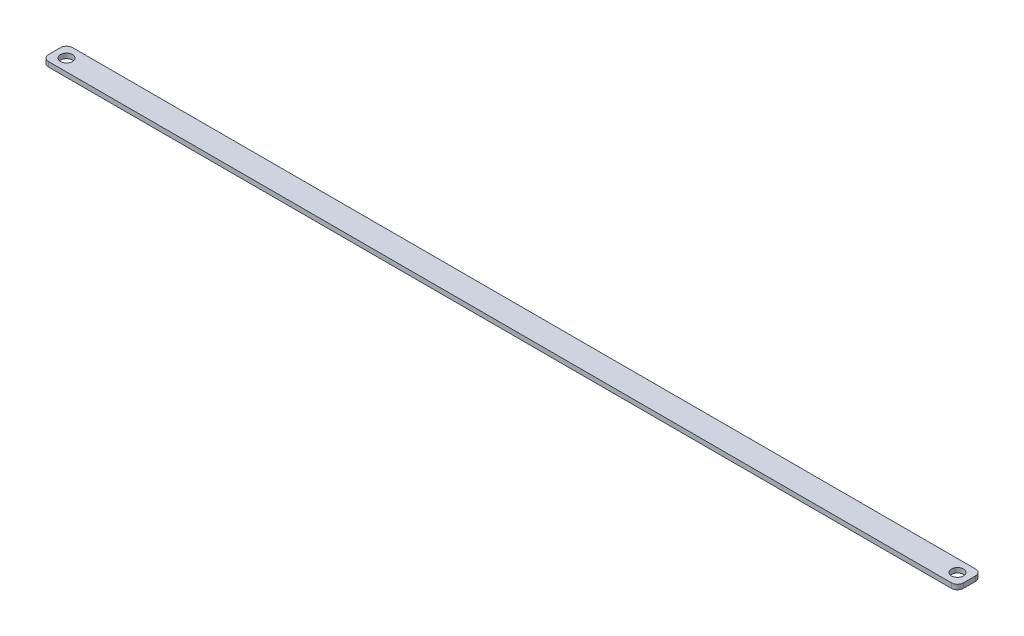
ISO-10303-21;
HEADER;
FILE_DESCRIPTION(('STEP AP214'),'2;1');
FILE_NAME('part.step','',(''),(''),'','','');
FILE_SCHEMA(('AUTOMOTIVE_DESIGN { 1 0 10303 214 1 1 1 1 }'));
ENDSEC;
DATA;
#1=APPLICATION_CONTEXT('core data for automotive mechanical design processes');
#2=APPLICATION_PROTOCOL_DEFINITION('international standard','automotive_design',2000,#1);
#3=PRODUCT_CONTEXT('',#1,'mechanical');
#4=PRODUCT('Part','Part','',(#3));
#5=PRODUCT_RELATED_PRODUCT_CATEGORY('part','',(#4));
#6=PRODUCT_DEFINITION_FORMATION('','',#4);
#7=PRODUCT_DEFINITION_CONTEXT('part definition',#1,'design');
#8=PRODUCT_DEFINITION('design','',#6,#7);
#9=PRODUCT_DEFINITION_SHAPE('','',#8);
#10=(LENGTH_UNIT() NAMED_UNIT(*) SI_UNIT(.MILLI.,.METRE.));
#11=(NAMED_UNIT(*) PLANE_ANGLE_UNIT() SI_UNIT($,.RADIAN.));
#12=(NAMED_UNIT(*) SI_UNIT($,.STERADIAN.) SOLID_ANGLE_UNIT());
#13=UNCERTAINTY_MEASURE_WITH_UNIT(LENGTH_MEASURE(1.E-05),#10,'distance_accuracy_value','');
#14=(GEOMETRIC_REPRESENTATION_CONTEXT(3) GLOBAL_UNCERTAINTY_ASSIGNED_CONTEXT((#13)) GLOBAL_UNIT_ASSIGNED_CONTEXT((#10,
#11,#12)) REPRESENTATION_CONTEXT('',''));
#15=CARTESIAN_POINT('',(0.,0.,0.));
#16=DIRECTION('',(0.,0.,1.));
#17=DIRECTION('',(1.,0.,0.));
#18=AXIS2_PLACEMENT_3D('',#15,#16,#17);
#19=CARTESIAN_POINT('',(213.984714800264,2.,-5.));
#20=DIRECTION('',(0.,-1.,0.));
#21=DIRECTION('',(0.,0.,-1.));
#22=AXIS2_PLACEMENT_3D('',#19,#20,#21);
#23=CYLINDRICAL_SURFACE('',#22,2.5);
#24=CARTESIAN_POINT('',(213.984714800264,0.,-5.));
#25=DIRECTION('',(0.,1.,0.));
#26=DIRECTION('',(0.,0.,1.));
#27=AXIS2_PLACEMENT_3D('',#24,#25,#26);
#28=CIRCLE('',#27,2.5);
#29=CARTESIAN_POINT('',(213.984714800264,0.,-2.5));
#30=VERTEX_POINT('',#29);
#31=EDGE_CURVE('E220',#30,#30,#28,.T.);
#32=ORIENTED_EDGE('',*,*,#31,.F.);
#33=EDGE_LOOP('',(#32));
#34=FACE_BOUND('',#33,.T.);
#35=CARTESIAN_POINT('',(213.984714800264,2.,-5.));
#36=DIRECTION('',(0.,1.,0.));
#37=DIRECTION('',(0.,0.,1.));
#38=AXIS2_PLACEMENT_3D('',#35,#36,#37);
#39=CIRCLE('',#38,2.5);
#40=CARTESIAN_POINT('',(213.984714800264,2.,-2.5));
#41=VERTEX_POINT('',#40);
#42=EDGE_CURVE('E13',#41,#41,#39,.T.);
#43=ORIENTED_EDGE('',*,*,#42,.T.);
#44=EDGE_LOOP('',(#43));
#45=FACE_BOUND('',#44,.T.);
#46=ADVANCED_FACE('F93',(#34,#45),#23,.F.);
#47=CARTESIAN_POINT('',(-156.015285199736,2.,-5.));
#48=DIRECTION('',(0.,-1.,0.));
#49=DIRECTION('',(0.,0.,-1.));
#50=AXIS2_PLACEMENT_3D('',#47,#48,#49);
#51=CYLINDRICAL_SURFACE('',#50,2.5);
#52=CARTESIAN_POINT('',(-156.015285199736,0.,-5.));
#53=DIRECTION('',(0.,1.,0.));
#54=DIRECTION('',(0.,0.,1.));
#55=AXIS2_PLACEMENT_3D('',#52,#53,#54);
#56=CIRCLE('',#55,2.5);
#57=CARTESIAN_POINT('',(-156.015285199736,0.,-2.5));
#58=VERTEX_POINT('',#57);
#59=EDGE_CURVE('E233',#58,#58,#56,.T.);
#60=ORIENTED_EDGE('',*,*,#59,.F.);
#61=EDGE_LOOP('',(#60));
#62=FACE_BOUND('',#61,.T.);
#63=CARTESIAN_POINT('',(-156.015285199736,2.,-5.));
#64=DIRECTION('',(0.,1.,0.));
#65=DIRECTION('',(0.,0.,1.));
#66=AXIS2_PLACEMENT_3D('',#63,#64,#65);
#67=CIRCLE('',#66,2.5);
#68=CARTESIAN_POINT('',(-156.015285199736,2.,-2.5));
#69=VERTEX_POINT('',#68);
#70=EDGE_CURVE('E103',#69,#69,#67,.T.);
#71=ORIENTED_EDGE('',*,*,#70,.T.);
#72=EDGE_LOOP('',(#71));
#73=FACE_BOUND('',#72,.T.);
#74=ADVANCED_FACE('F254',(#62,#73),#51,.F.);
#75=CARTESIAN_POINT('',(47.5,2.,-2.5));
#76=DIRECTION('',(0.,1.,0.));
#77=DIRECTION('',(0.,0.,1.));
#78=AXIS2_PLACEMENT_3D('',#75,#76,#77);
#79=PLANE('',#78);
#80=DIRECTION('',(1.,0.,0.));
#81=VECTOR('',#80,1.);
#82=CARTESIAN_POINT('',(-158.515285199736,2.,0.));
#83=LINE('',#82,#81);
#84=CARTESIAN_POINT('',(-158.515285199736,2.,0.));
#85=VERTEX_POINT('',#84);
#86=CARTESIAN_POINT('',(216.484714800264,2.,0.));
#87=VERTEX_POINT('',#86);
#88=EDGE_CURVE('E156',#85,#87,#83,.T.);
#89=ORIENTED_EDGE('',*,*,#88,.T.);
#90=CARTESIAN_POINT('',(216.484714800264,2.,-2.5));
#91=DIRECTION('',(0.,1.,0.));
#92=DIRECTION('',(0.,0.,1.));
#93=AXIS2_PLACEMENT_3D('',#90,#91,#92);
#94=CIRCLE('',#93,2.5);
#95=CARTESIAN_POINT('',(218.984714800264,2.,-2.50000000000002));
#96=VERTEX_POINT('',#95);
#97=EDGE_CURVE('E162',#87,#96,#94,.T.);
#98=ORIENTED_EDGE('',*,*,#97,.T.);
#99=DIRECTION('',(0.,0.,-1.));
#100=VECTOR('',#99,1.);
#101=CARTESIAN_POINT('',(218.984714800264,2.,-2.50000000000002));
#102=LINE('',#101,#100);
#103=CARTESIAN_POINT('',(218.984714800264,2.,-7.49999999999998));
#104=VERTEX_POINT('',#103);
#105=EDGE_CURVE('E184',#96,#104,#102,.T.);
#106=ORIENTED_EDGE('',*,*,#105,.T.);
#107=CARTESIAN_POINT('',(216.484714800264,2.,-7.5));
#108=DIRECTION('',(0.,1.,0.));
#109=DIRECTION('',(0.,0.,-1.));
#110=AXIS2_PLACEMENT_3D('',#107,#108,#109);
#111=CIRCLE('',#110,2.5);
#112=CARTESIAN_POINT('',(216.484714800264,2.,-10.));
#113=VERTEX_POINT('',#112);
#114=EDGE_CURVE('E188',#104,#113,#111,.T.);
#115=ORIENTED_EDGE('',*,*,#114,.T.);
#116=DIRECTION('',(-1.,0.,0.));
#117=VECTOR('',#116,1.);
#118=CARTESIAN_POINT('',(171.484714800264,2.,-10.));
#119=LINE('',#118,#117);
#120=CARTESIAN_POINT('',(-158.515285199736,2.,-10.));
#121=VERTEX_POINT('',#120);
#122=EDGE_CURVE('E242',#113,#121,#119,.T.);
#123=ORIENTED_EDGE('',*,*,#122,.T.);
#124=CARTESIAN_POINT('',(-158.515285199736,2.,-7.5));
#125=DIRECTION('',(0.,1.,0.));
#126=DIRECTION('',(0.,0.,-1.));
#127=AXIS2_PLACEMENT_3D('',#124,#125,#126);
#128=CIRCLE('',#127,2.5);
#129=CARTESIAN_POINT('',(-161.015285199736,2.,-7.49999999999998));
#130=VERTEX_POINT('',#129);
#131=EDGE_CURVE('E168',#121,#130,#128,.T.);
#132=ORIENTED_EDGE('',*,*,#131,.T.);
#133=DIRECTION('',(0.,0.,1.));
#134=VECTOR('',#133,1.);
#135=CARTESIAN_POINT('',(-161.015285199736,2.,-2.50000000000002));
#136=LINE('',#135,#134);
#137=CARTESIAN_POINT('',(-161.015285199736,2.,-2.50000000000002));
#138=VERTEX_POINT('',#137);
#139=EDGE_CURVE('E186',#130,#138,#136,.T.);
#140=ORIENTED_EDGE('',*,*,#139,.T.);
#141=CARTESIAN_POINT('',(-158.515285199736,2.,-2.5));
#142=DIRECTION('',(0.,1.,0.));
#143=DIRECTION('',(0.,0.,-1.));
#144=AXIS2_PLACEMENT_3D('',#141,#142,#143);
#145=CIRCLE('',#144,2.5);
#146=EDGE_CURVE('E165',#138,#85,#145,.T.);
#147=ORIENTED_EDGE('',*,*,#146,.T.);
#148=EDGE_LOOP('',(#89,#98,#106,#115,#123,#132,#140,#147));
#149=FACE_BOUND('',#148,.T.);
#150=ORIENTED_EDGE('',*,*,#42,.F.);
#151=EDGE_LOOP('',(#150));
#152=FACE_BOUND('',#151,.T.);
#153=ORIENTED_EDGE('',*,*,#70,.F.);
#154=EDGE_LOOP('',(#153));
#155=FACE_BOUND('',#154,.T.);
#156=ADVANCED_FACE('F158',(#149,#152,#155),#79,.T.);
#157=CARTESIAN_POINT('',(216.484714800264,0.,-2.5));
#158=DIRECTION('',(0.,1.,0.));
#159=DIRECTION('',(0.,0.,1.));
#160=AXIS2_PLACEMENT_3D('',#157,#158,#159);
#161=PLANE('',#160);
#162=ORIENTED_EDGE('',*,*,#31,.T.);
#163=EDGE_LOOP('',(#162));
#164=FACE_BOUND('',#163,.T.);
#165=CARTESIAN_POINT('',(216.484714800264,0.,-2.5));
#166=DIRECTION('',(0.,1.,0.));
#167=DIRECTION('',(0.,0.,1.));
#168=AXIS2_PLACEMENT_3D('',#165,#166,#167);
#169=CIRCLE('',#168,2.5);
#170=CARTESIAN_POINT('',(216.484714800264,0.,0.));
#171=VERTEX_POINT('',#170);
#172=CARTESIAN_POINT('',(218.984714800264,0.,-2.50000000000002));
#173=VERTEX_POINT('',#172);
#174=EDGE_CURVE('E177',#171,#173,#169,.T.);
#175=ORIENTED_EDGE('',*,*,#174,.F.);
#176=DIRECTION('',(1.,0.,0.));
#177=VECTOR('',#176,1.);
#178=CARTESIAN_POINT('',(-158.515285199736,0.,0.));
#179=LINE('',#178,#177);
#180=CARTESIAN_POINT('',(-158.515285199736,0.,0.));
#181=VERTEX_POINT('',#180);
#182=EDGE_CURVE('E173',#181,#171,#179,.T.);
#183=ORIENTED_EDGE('',*,*,#182,.F.);
#184=CARTESIAN_POINT('',(-158.515285199736,0.,-2.5));
#185=DIRECTION('',(0.,1.,0.));
#186=DIRECTION('',(0.,0.,-1.));
#187=AXIS2_PLACEMENT_3D('',#184,#185,#186);
#188=CIRCLE('',#187,2.5);
#189=CARTESIAN_POINT('',(-161.015285199736,0.,-2.50000000000002));
#190=VERTEX_POINT('',#189);
#191=EDGE_CURVE('E199',#190,#181,#188,.T.);
#192=ORIENTED_EDGE('',*,*,#191,.F.);
#193=DIRECTION('',(0.,0.,1.));
#194=VECTOR('',#193,1.);
#195=CARTESIAN_POINT('',(-161.015285199736,0.,-2.50000000000002));
#196=LINE('',#195,#194);
#197=CARTESIAN_POINT('',(-161.015285199736,0.,-7.49999999999998));
#198=VERTEX_POINT('',#197);
#199=EDGE_CURVE('E206',#198,#190,#196,.T.);
#200=ORIENTED_EDGE('',*,*,#199,.F.);
#201=CARTESIAN_POINT('',(-158.515285199736,0.,-7.5));
#202=DIRECTION('',(0.,1.,0.));
#203=DIRECTION('',(0.,0.,-1.));
#204=AXIS2_PLACEMENT_3D('',#201,#202,#203);
#205=CIRCLE('',#204,2.5);
#206=CARTESIAN_POINT('',(-158.515285199736,0.,-10.));
#207=VERTEX_POINT('',#206);
#208=EDGE_CURVE('E212',#207,#198,#205,.T.);
#209=ORIENTED_EDGE('',*,*,#208,.F.);
#210=DIRECTION('',(-1.,0.,0.));
#211=VECTOR('',#210,1.);
#212=CARTESIAN_POINT('',(171.484714800264,0.,-10.));
#213=LINE('',#212,#211);
#214=CARTESIAN_POINT('',(216.484714800264,0.,-10.));
#215=VERTEX_POINT('',#214);
#216=EDGE_CURVE('E218',#215,#207,#213,.T.);
#217=ORIENTED_EDGE('',*,*,#216,.F.);
#218=CARTESIAN_POINT('',(216.484714800264,0.,-7.5));
#219=DIRECTION('',(0.,1.,0.));
#220=DIRECTION('',(0.,0.,-1.));
#221=AXIS2_PLACEMENT_3D('',#218,#219,#220);
#222=CIRCLE('',#221,2.5);
#223=CARTESIAN_POINT('',(218.984714800264,0.,-7.49999999999998));
#224=VERTEX_POINT('',#223);
#225=EDGE_CURVE('E223',#224,#215,#222,.T.);
#226=ORIENTED_EDGE('',*,*,#225,.F.);
#227=DIRECTION('',(0.,0.,-1.));
#228=VECTOR('',#227,1.);
#229=CARTESIAN_POINT('',(218.984714800264,0.,-2.50000000000002));
#230=LINE('',#229,#228);
#231=EDGE_CURVE('E178',#173,#224,#230,.T.);
#232=ORIENTED_EDGE('',*,*,#231,.F.);
#233=EDGE_LOOP('',(#175,#183,#192,#200,#209,#217,#226,#232));
#234=FACE_BOUND('',#233,.T.);
#235=ORIENTED_EDGE('',*,*,#59,.T.);
#236=EDGE_LOOP('',(#235));
#237=FACE_BOUND('',#236,.T.);
#238=ADVANCED_FACE('F249',(#164,#234,#237),#161,.F.);
#239=CARTESIAN_POINT('',(171.484714800264,2.,-10.));
#240=DIRECTION('',(0.,0.,1.));
#241=DIRECTION('',(1.,0.,0.));
#242=AXIS2_PLACEMENT_3D('',#239,#240,#241);
#243=PLANE('',#242);
#244=ORIENTED_EDGE('',*,*,#216,.T.);
#245=DIRECTION('',(0.,-1.,0.));
#246=VECTOR('',#245,1.);
#247=CARTESIAN_POINT('',(-158.515285199736,2.,-10.));
#248=LINE('',#247,#246);
#249=EDGE_CURVE('E209',#121,#207,#248,.T.);
#250=ORIENTED_EDGE('',*,*,#249,.F.);
#251=ORIENTED_EDGE('',*,*,#122,.F.);
#252=DIRECTION('',(0.,-1.,0.));
#253=VECTOR('',#252,1.);
#254=CARTESIAN_POINT('',(216.484714800264,2.,-10.));
#255=LINE('',#254,#253);
#256=EDGE_CURVE('E112',#113,#215,#255,.T.);
#257=ORIENTED_EDGE('',*,*,#256,.T.);
#258=EDGE_LOOP('',(#244,#250,#251,#257));
#259=FACE_BOUND('',#258,.T.);
#260=ADVANCED_FACE('F271',(#259),#243,.F.);
#261=CARTESIAN_POINT('',(171.484714800264,2.,0.));
#262=DIRECTION('',(0.,0.,-1.));
#263=DIRECTION('',(-1.,0.,0.));
#264=AXIS2_PLACEMENT_3D('',#261,#262,#263);
#265=PLANE('',#264);
#266=DIRECTION('',(0.,-1.,0.));
#267=VECTOR('',#266,1.);
#268=CARTESIAN_POINT('',(216.484714800264,2.,0.));
#269=LINE('',#268,#267);
#270=EDGE_CURVE('E171',#87,#171,#269,.T.);
#271=ORIENTED_EDGE('',*,*,#270,.F.);
#272=ORIENTED_EDGE('',*,*,#88,.F.);
#273=DIRECTION('',(0.,-1.,0.));
#274=VECTOR('',#273,1.);
#275=CARTESIAN_POINT('',(-158.515285199736,2.,0.));
#276=LINE('',#275,#274);
#277=EDGE_CURVE('E196',#85,#181,#276,.T.);
#278=ORIENTED_EDGE('',*,*,#277,.T.);
#279=ORIENTED_EDGE('',*,*,#182,.T.);
#280=EDGE_LOOP('',(#271,#272,#278,#279));
#281=FACE_BOUND('',#280,.T.);
#282=ADVANCED_FACE('F172',(#281),#265,.F.);
#283=CARTESIAN_POINT('',(216.484714800264,2.,-2.5));
#284=DIRECTION('',(0.,-1.,0.));
#285=DIRECTION('',(0.,0.,-1.));
#286=AXIS2_PLACEMENT_3D('',#283,#284,#285);
#287=CYLINDRICAL_SURFACE('',#286,2.5);
#288=ORIENTED_EDGE('',*,*,#174,.T.);
#289=DIRECTION('',(0.,-1.,0.));
#290=VECTOR('',#289,1.);
#291=CARTESIAN_POINT('',(218.984714800264,2.,-2.50000000000002));
#292=LINE('',#291,#290);
#293=EDGE_CURVE('E182',#96,#173,#292,.T.);
#294=ORIENTED_EDGE('',*,*,#293,.F.);
#295=ORIENTED_EDGE('',*,*,#97,.F.);
#296=ORIENTED_EDGE('',*,*,#270,.T.);
#297=EDGE_LOOP('',(#288,#294,#295,#296));
#298=FACE_BOUND('',#297,.T.);
#299=ADVANCED_FACE('F180',(#298),#287,.T.);
#300=CARTESIAN_POINT('',(218.984714800264,2.,-2.50000000000002));
#301=DIRECTION('',(-1.,0.,0.));
#302=DIRECTION('',(0.,0.,1.));
#303=AXIS2_PLACEMENT_3D('',#300,#301,#302);
#304=PLANE('',#303);
#305=ORIENTED_EDGE('',*,*,#231,.T.);
#306=DIRECTION('',(0.,-1.,0.));
#307=VECTOR('',#306,1.);
#308=CARTESIAN_POINT('',(218.984714800264,2.,-7.49999999999998));
#309=LINE('',#308,#307);
#310=EDGE_CURVE('E215',#104,#224,#309,.T.);
#311=ORIENTED_EDGE('',*,*,#310,.F.);
#312=ORIENTED_EDGE('',*,*,#105,.F.);
#313=ORIENTED_EDGE('',*,*,#293,.T.);
#314=EDGE_LOOP('',(#305,#311,#312,#313));
#315=FACE_BOUND('',#314,.T.);
#316=ADVANCED_FACE('F278',(#315),#304,.F.);
#317=CARTESIAN_POINT('',(216.484714800264,2.,-7.5));
#318=DIRECTION('',(0.,-1.,0.));
#319=DIRECTION('',(0.,0.,-1.));
#320=AXIS2_PLACEMENT_3D('',#317,#318,#319);
#321=CYLINDRICAL_SURFACE('',#320,2.5);
#322=ORIENTED_EDGE('',*,*,#225,.T.);
#323=ORIENTED_EDGE('',*,*,#256,.F.);
#324=ORIENTED_EDGE('',*,*,#114,.F.);
#325=ORIENTED_EDGE('',*,*,#310,.T.);
#326=EDGE_LOOP('',(#322,#323,#324,#325));
#327=FACE_BOUND('',#326,.T.);
#328=ADVANCED_FACE('F281',(#327),#321,.T.);
#329=CARTESIAN_POINT('',(-158.515285199736,2.,-7.5));
#330=DIRECTION('',(0.,-1.,0.));
#331=DIRECTION('',(0.,0.,-1.));
#332=AXIS2_PLACEMENT_3D('',#329,#330,#331);
#333=CYLINDRICAL_SURFACE('',#332,2.5);
#334=ORIENTED_EDGE('',*,*,#208,.T.);
#335=DIRECTION('',(0.,-1.,0.));
#336=VECTOR('',#335,1.);
#337=CARTESIAN_POINT('',(-161.015285199736,2.,-7.49999999999998));
#338=LINE('',#337,#336);
#339=EDGE_CURVE('E202',#130,#198,#338,.T.);
#340=ORIENTED_EDGE('',*,*,#339,.F.);
#341=ORIENTED_EDGE('',*,*,#131,.F.);
#342=ORIENTED_EDGE('',*,*,#249,.T.);
#343=EDGE_LOOP('',(#334,#340,#341,#342));
#344=FACE_BOUND('',#343,.T.);
#345=ADVANCED_FACE('F285',(#344),#333,.T.);
#346=CARTESIAN_POINT('',(-161.015285199736,2.,-2.50000000000002));
#347=DIRECTION('',(1.,0.,0.));
#348=DIRECTION('',(0.,0.,-1.));
#349=AXIS2_PLACEMENT_3D('',#346,#347,#348);
#350=PLANE('',#349);
#351=ORIENTED_EDGE('',*,*,#199,.T.);
#352=DIRECTION('',(0.,-1.,0.));
#353=VECTOR('',#352,1.);
#354=CARTESIAN_POINT('',(-161.015285199736,2.,-2.50000000000002));
#355=LINE('',#354,#353);
#356=EDGE_CURVE('E203',#138,#190,#355,.T.);
#357=ORIENTED_EDGE('',*,*,#356,.F.);
#358=ORIENTED_EDGE('',*,*,#139,.F.);
#359=ORIENTED_EDGE('',*,*,#339,.T.);
#360=EDGE_LOOP('',(#351,#357,#358,#359));
#361=FACE_BOUND('',#360,.T.);
#362=ADVANCED_FACE('F288',(#361),#350,.F.);
#363=CARTESIAN_POINT('',(-158.515285199736,2.,-2.5));
#364=DIRECTION('',(0.,-1.,0.));
#365=DIRECTION('',(0.,0.,-1.));
#366=AXIS2_PLACEMENT_3D('',#363,#364,#365);
#367=CYLINDRICAL_SURFACE('',#366,2.5);
#368=ORIENTED_EDGE('',*,*,#191,.T.);
#369=ORIENTED_EDGE('',*,*,#277,.F.);
#370=ORIENTED_EDGE('',*,*,#146,.F.);
#371=ORIENTED_EDGE('',*,*,#356,.T.);
#372=EDGE_LOOP('',(#368,#369,#370,#371));
#373=FACE_BOUND('',#372,.T.);
#374=ADVANCED_FACE('F95',(#373),#367,.T.);
#375=CLOSED_SHELL('',(#46,#74,#156,#238,#260,#282,#299,#316,#328,#345,#362,#374));
#376=MANIFOLD_SOLID_BREP('B2',#375);
#377=ADVANCED_BREP_SHAPE_REPRESENTATION('',(#18,#376),#14);
#378=SHAPE_DEFINITION_REPRESENTATION(#9,#377);
ENDSEC;
END-ISO-10303-21;
